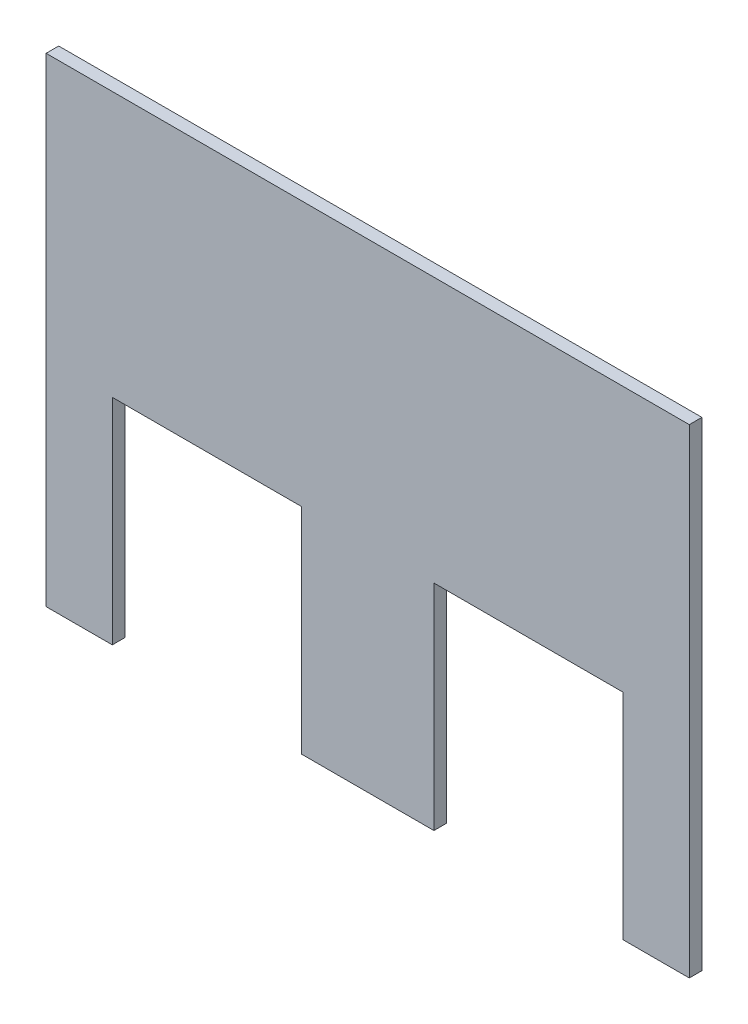
ISO-10303-21;
HEADER;
FILE_DESCRIPTION(('STEP AP214'),'2;1');
FILE_NAME('part.step','',(''),(''),'','','');
FILE_SCHEMA(('AUTOMOTIVE_DESIGN { 1 0 10303 214 1 1 1 1 }'));
ENDSEC;
DATA;
#1=APPLICATION_CONTEXT('core data for automotive mechanical design processes');
#2=APPLICATION_PROTOCOL_DEFINITION('international standard','automotive_design',2000,#1);
#3=PRODUCT_CONTEXT('',#1,'mechanical');
#4=PRODUCT('Part','Part','',(#3));
#5=PRODUCT_RELATED_PRODUCT_CATEGORY('part','',(#4));
#6=PRODUCT_DEFINITION_FORMATION('','',#4);
#7=PRODUCT_DEFINITION_CONTEXT('part definition',#1,'design');
#8=PRODUCT_DEFINITION('design','',#6,#7);
#9=PRODUCT_DEFINITION_SHAPE('','',#8);
#10=(LENGTH_UNIT() NAMED_UNIT(*) SI_UNIT(.MILLI.,.METRE.));
#11=(NAMED_UNIT(*) PLANE_ANGLE_UNIT() SI_UNIT($,.RADIAN.));
#12=(NAMED_UNIT(*) SI_UNIT($,.STERADIAN.) SOLID_ANGLE_UNIT());
#13=UNCERTAINTY_MEASURE_WITH_UNIT(LENGTH_MEASURE(1.E-05),#10,'distance_accuracy_value','');
#14=(GEOMETRIC_REPRESENTATION_CONTEXT(3) GLOBAL_UNCERTAINTY_ASSIGNED_CONTEXT((#13)) GLOBAL_UNIT_ASSIGNED_CONTEXT((#10,
#11,#12)) REPRESENTATION_CONTEXT('',''));
#15=CARTESIAN_POINT('',(0.,0.,0.));
#16=DIRECTION('',(0.,0.,1.));
#17=DIRECTION('',(1.,0.,0.));
#18=AXIS2_PLACEMENT_3D('',#15,#16,#17);
#19=CARTESIAN_POINT('',(0.,3.60822483003176E-12,10.));
#20=DIRECTION('',(0.,1.,0.));
#21=DIRECTION('',(0.,0.,1.));
#22=AXIS2_PLACEMENT_3D('',#19,#20,#21);
#23=PLANE('',#22);
#24=DIRECTION('',(0.,0.,1.));
#25=VECTOR('',#24,1.);
#26=CARTESIAN_POINT('',(52.5,0.,0.));
#27=LINE('',#26,#25);
#28=CARTESIAN_POINT('',(52.5,3.60822483003176E-12,0.));
#29=VERTEX_POINT('',#28);
#30=CARTESIAN_POINT('',(52.5,0.,10.));
#31=VERTEX_POINT('',#30);
#32=EDGE_CURVE('E55',#29,#31,#27,.T.);
#33=ORIENTED_EDGE('',*,*,#32,.T.);
#34=DIRECTION('',(1.,0.,0.));
#35=VECTOR('',#34,1.);
#36=CARTESIAN_POINT('',(0.,3.60822483003176E-12,10.));
#37=LINE('',#36,#35);
#38=CARTESIAN_POINT('',(0.,3.60822483003176E-12,10.));
#39=VERTEX_POINT('',#38);
#40=EDGE_CURVE('E184',#39,#31,#37,.T.);
#41=ORIENTED_EDGE('',*,*,#40,.F.);
#42=DIRECTION('',(0.,0.,-1.));
#43=VECTOR('',#42,1.);
#44=CARTESIAN_POINT('',(0.,3.60822483003176E-12,10.));
#45=LINE('',#44,#43);
#46=CARTESIAN_POINT('',(0.,3.60822483003176E-12,0.));
#47=VERTEX_POINT('',#46);
#48=EDGE_CURVE('E11',#39,#47,#45,.T.);
#49=ORIENTED_EDGE('',*,*,#48,.T.);
#50=DIRECTION('',(1.,0.,0.));
#51=VECTOR('',#50,1.);
#52=CARTESIAN_POINT('',(0.,3.60822483003176E-12,0.));
#53=LINE('',#52,#51);
#54=EDGE_CURVE('E196',#47,#29,#53,.T.);
#55=ORIENTED_EDGE('',*,*,#54,.T.);
#56=EDGE_LOOP('',(#33,#41,#49,#55));
#57=FACE_BOUND('',#56,.T.);
#58=ADVANCED_FACE('F32',(#57),#23,.F.);
#59=CARTESIAN_POINT('',(202.5,0.,10.));
#60=VERTEX_POINT('',#59);
#61=CARTESIAN_POINT('',(307.5,0.,10.));
#62=VERTEX_POINT('',#61);
#63=EDGE_CURVE('E188',#60,#62,#37,.T.);
#64=ORIENTED_EDGE('',*,*,#63,.F.);
#65=DIRECTION('',(0.,0.,1.));
#66=VECTOR('',#65,1.);
#67=CARTESIAN_POINT('',(202.5,0.,0.));
#68=LINE('',#67,#66);
#69=CARTESIAN_POINT('',(202.5,0.,0.));
#70=VERTEX_POINT('',#69);
#71=EDGE_CURVE('E153',#70,#60,#68,.T.);
#72=ORIENTED_EDGE('',*,*,#71,.F.);
#73=CARTESIAN_POINT('',(307.5,0.,0.));
#74=VERTEX_POINT('',#73);
#75=EDGE_CURVE('E199',#70,#74,#53,.T.);
#76=ORIENTED_EDGE('',*,*,#75,.T.);
#77=DIRECTION('',(0.,0.,1.));
#78=VECTOR('',#77,1.);
#79=CARTESIAN_POINT('',(307.5,0.,0.));
#80=LINE('',#79,#78);
#81=EDGE_CURVE('E148',#74,#62,#80,.T.);
#82=ORIENTED_EDGE('',*,*,#81,.T.);
#83=EDGE_LOOP('',(#64,#72,#76,#82));
#84=FACE_BOUND('',#83,.T.);
#85=ADVANCED_FACE('F235',(#84),#23,.F.);
#86=CARTESIAN_POINT('',(0.,0.,10.));
#87=DIRECTION('',(0.,0.,1.));
#88=DIRECTION('',(1.,0.,0.));
#89=AXIS2_PLACEMENT_3D('',#86,#87,#88);
#90=PLANE('',#89);
#91=DIRECTION('',(0.,1.,0.));
#92=VECTOR('',#91,1.);
#93=CARTESIAN_POINT('',(202.5,0.,10.));
#94=LINE('',#93,#92);
#95=CARTESIAN_POINT('',(202.5,170.,10.));
#96=VERTEX_POINT('',#95);
#97=EDGE_CURVE('E140',#60,#96,#94,.T.);
#98=ORIENTED_EDGE('',*,*,#97,.F.);
#99=ORIENTED_EDGE('',*,*,#63,.T.);
#100=DIRECTION('',(0.,1.,0.));
#101=VECTOR('',#100,1.);
#102=CARTESIAN_POINT('',(307.5,0.,10.));
#103=LINE('',#102,#101);
#104=CARTESIAN_POINT('',(307.5,170.,10.));
#105=VERTEX_POINT('',#104);
#106=EDGE_CURVE('E159',#62,#105,#103,.T.);
#107=ORIENTED_EDGE('',*,*,#106,.T.);
#108=DIRECTION('',(-1.,0.,0.));
#109=VECTOR('',#108,1.);
#110=CARTESIAN_POINT('',(0.,170.,10.));
#111=LINE('',#110,#109);
#112=CARTESIAN_POINT('',(457.5,170.,10.));
#113=VERTEX_POINT('',#112);
#114=EDGE_CURVE('E167',#113,#105,#111,.T.);
#115=ORIENTED_EDGE('',*,*,#114,.F.);
#116=DIRECTION('',(0.,1.,0.));
#117=VECTOR('',#116,1.);
#118=CARTESIAN_POINT('',(457.5,0.,10.));
#119=LINE('',#118,#117);
#120=CARTESIAN_POINT('',(457.5,0.,10.));
#121=VERTEX_POINT('',#120);
#122=EDGE_CURVE('E164',#121,#113,#119,.T.);
#123=ORIENTED_EDGE('',*,*,#122,.F.);
#124=CARTESIAN_POINT('',(510.,3.60822483003176E-12,10.));
#125=VERTEX_POINT('',#124);
#126=EDGE_CURVE('E182',#121,#125,#37,.T.);
#127=ORIENTED_EDGE('',*,*,#126,.T.);
#128=DIRECTION('',(0.,1.,0.));
#129=VECTOR('',#128,1.);
#130=CARTESIAN_POINT('',(510.,380.,10.));
#131=LINE('',#130,#129);
#132=CARTESIAN_POINT('',(510.,380.,10.));
#133=VERTEX_POINT('',#132);
#134=EDGE_CURVE('E187',#125,#133,#131,.T.);
#135=ORIENTED_EDGE('',*,*,#134,.T.);
#136=DIRECTION('',(-1.,0.,0.));
#137=VECTOR('',#136,1.);
#138=CARTESIAN_POINT('',(0.,380.,10.));
#139=LINE('',#138,#137);
#140=CARTESIAN_POINT('',(0.,380.,10.));
#141=VERTEX_POINT('',#140);
#142=EDGE_CURVE('E190',#133,#141,#139,.T.);
#143=ORIENTED_EDGE('',*,*,#142,.T.);
#144=DIRECTION('',(0.,-1.,0.));
#145=VECTOR('',#144,1.);
#146=CARTESIAN_POINT('',(0.,380.,10.));
#147=LINE('',#146,#145);
#148=EDGE_CURVE('E179',#141,#39,#147,.T.);
#149=ORIENTED_EDGE('',*,*,#148,.T.);
#150=ORIENTED_EDGE('',*,*,#40,.T.);
#151=DIRECTION('',(0.,1.,0.));
#152=VECTOR('',#151,1.);
#153=CARTESIAN_POINT('',(52.5,0.,10.));
#154=LINE('',#153,#152);
#155=CARTESIAN_POINT('',(52.5,170.,10.));
#156=VERTEX_POINT('',#155);
#157=EDGE_CURVE('E143',#31,#156,#154,.T.);
#158=ORIENTED_EDGE('',*,*,#157,.T.);
#159=DIRECTION('',(1.,0.,0.));
#160=VECTOR('',#159,1.);
#161=CARTESIAN_POINT('',(0.,170.,10.));
#162=LINE('',#161,#160);
#163=EDGE_CURVE('E134',#156,#96,#162,.T.);
#164=ORIENTED_EDGE('',*,*,#163,.T.);
#165=EDGE_LOOP('',(#98,#99,#107,#115,#123,#127,#135,#143,#149,#150,#158,#164));
#166=FACE_BOUND('',#165,.T.);
#167=ADVANCED_FACE('F227',(#166),#90,.T.);
#168=CARTESIAN_POINT('',(0.,0.,0.));
#169=DIRECTION('',(0.,0.,1.));
#170=DIRECTION('',(1.,0.,0.));
#171=AXIS2_PLACEMENT_3D('',#168,#169,#170);
#172=PLANE('',#171);
#173=ORIENTED_EDGE('',*,*,#75,.F.);
#174=DIRECTION('',(0.,1.,0.));
#175=VECTOR('',#174,1.);
#176=CARTESIAN_POINT('',(202.5,0.,0.));
#177=LINE('',#176,#175);
#178=CARTESIAN_POINT('',(202.5,170.,0.));
#179=VERTEX_POINT('',#178);
#180=EDGE_CURVE('E127',#70,#179,#177,.T.);
#181=ORIENTED_EDGE('',*,*,#180,.T.);
#182=DIRECTION('',(1.,0.,0.));
#183=VECTOR('',#182,1.);
#184=CARTESIAN_POINT('',(0.,170.,0.));
#185=LINE('',#184,#183);
#186=CARTESIAN_POINT('',(52.5,170.,0.));
#187=VERTEX_POINT('',#186);
#188=EDGE_CURVE('E128',#187,#179,#185,.T.);
#189=ORIENTED_EDGE('',*,*,#188,.F.);
#190=DIRECTION('',(0.,1.,0.));
#191=VECTOR('',#190,1.);
#192=CARTESIAN_POINT('',(52.5,0.,0.));
#193=LINE('',#192,#191);
#194=EDGE_CURVE('E119',#29,#187,#193,.T.);
#195=ORIENTED_EDGE('',*,*,#194,.F.);
#196=ORIENTED_EDGE('',*,*,#54,.F.);
#197=DIRECTION('',(0.,-1.,0.));
#198=VECTOR('',#197,1.);
#199=CARTESIAN_POINT('',(0.,380.,0.));
#200=LINE('',#199,#198);
#201=CARTESIAN_POINT('',(0.,380.,0.));
#202=VERTEX_POINT('',#201);
#203=EDGE_CURVE('E152',#202,#47,#200,.T.);
#204=ORIENTED_EDGE('',*,*,#203,.F.);
#205=DIRECTION('',(-1.,0.,0.));
#206=VECTOR('',#205,1.);
#207=CARTESIAN_POINT('',(0.,380.,0.));
#208=LINE('',#207,#206);
#209=CARTESIAN_POINT('',(510.,380.,0.));
#210=VERTEX_POINT('',#209);
#211=EDGE_CURVE('E183',#210,#202,#208,.T.);
#212=ORIENTED_EDGE('',*,*,#211,.F.);
#213=DIRECTION('',(0.,1.,0.));
#214=VECTOR('',#213,1.);
#215=CARTESIAN_POINT('',(510.,380.,0.));
#216=LINE('',#215,#214);
#217=CARTESIAN_POINT('',(510.,3.60822483003176E-12,0.));
#218=VERTEX_POINT('',#217);
#219=EDGE_CURVE('E198',#218,#210,#216,.T.);
#220=ORIENTED_EDGE('',*,*,#219,.F.);
#221=CARTESIAN_POINT('',(457.5,0.,0.));
#222=VERTEX_POINT('',#221);
#223=EDGE_CURVE('E195',#222,#218,#53,.T.);
#224=ORIENTED_EDGE('',*,*,#223,.F.);
#225=DIRECTION('',(0.,1.,0.));
#226=VECTOR('',#225,1.);
#227=CARTESIAN_POINT('',(457.5,0.,0.));
#228=LINE('',#227,#226);
#229=CARTESIAN_POINT('',(457.5,170.,0.));
#230=VERTEX_POINT('',#229);
#231=EDGE_CURVE('E156',#222,#230,#228,.T.);
#232=ORIENTED_EDGE('',*,*,#231,.T.);
#233=DIRECTION('',(-1.,0.,0.));
#234=VECTOR('',#233,1.);
#235=CARTESIAN_POINT('',(0.,170.,0.));
#236=LINE('',#235,#234);
#237=CARTESIAN_POINT('',(307.5,170.,0.));
#238=VERTEX_POINT('',#237);
#239=EDGE_CURVE('E47',#230,#238,#236,.T.);
#240=ORIENTED_EDGE('',*,*,#239,.T.);
#241=DIRECTION('',(0.,1.,0.));
#242=VECTOR('',#241,1.);
#243=CARTESIAN_POINT('',(307.5,0.,0.));
#244=LINE('',#243,#242);
#245=EDGE_CURVE('E161',#74,#238,#244,.T.);
#246=ORIENTED_EDGE('',*,*,#245,.F.);
#247=EDGE_LOOP('',(#173,#181,#189,#195,#196,#204,#212,#220,#224,#232,#240,#246));
#248=FACE_BOUND('',#247,.T.);
#249=ADVANCED_FACE('F139',(#248),#172,.F.);
#250=CARTESIAN_POINT('',(0.,380.,10.));
#251=DIRECTION('',(1.,0.,0.));
#252=DIRECTION('',(0.,0.,-1.));
#253=AXIS2_PLACEMENT_3D('',#250,#251,#252);
#254=PLANE('',#253);
#255=ORIENTED_EDGE('',*,*,#203,.T.);
#256=ORIENTED_EDGE('',*,*,#48,.F.);
#257=ORIENTED_EDGE('',*,*,#148,.F.);
#258=DIRECTION('',(0.,0.,-1.));
#259=VECTOR('',#258,1.);
#260=CARTESIAN_POINT('',(0.,380.,10.));
#261=LINE('',#260,#259);
#262=EDGE_CURVE('E192',#141,#202,#261,.T.);
#263=ORIENTED_EDGE('',*,*,#262,.T.);
#264=EDGE_LOOP('',(#255,#256,#257,#263));
#265=FACE_BOUND('',#264,.T.);
#266=ADVANCED_FACE('F34',(#265),#254,.F.);
#267=ORIENTED_EDGE('',*,*,#126,.F.);
#268=DIRECTION('',(0.,0.,1.));
#269=VECTOR('',#268,1.);
#270=CARTESIAN_POINT('',(457.5,0.,0.));
#271=LINE('',#270,#269);
#272=EDGE_CURVE('E163',#222,#121,#271,.T.);
#273=ORIENTED_EDGE('',*,*,#272,.F.);
#274=ORIENTED_EDGE('',*,*,#223,.T.);
#275=DIRECTION('',(0.,0.,-1.));
#276=VECTOR('',#275,1.);
#277=CARTESIAN_POINT('',(510.,3.60822483003176E-12,10.));
#278=LINE('',#277,#276);
#279=EDGE_CURVE('E40',#125,#218,#278,.T.);
#280=ORIENTED_EDGE('',*,*,#279,.F.);
#281=EDGE_LOOP('',(#267,#273,#274,#280));
#282=FACE_BOUND('',#281,.T.);
#283=ADVANCED_FACE('F242',(#282),#23,.F.);
#284=CARTESIAN_POINT('',(510.,380.,10.));
#285=DIRECTION('',(-1.,0.,0.));
#286=DIRECTION('',(0.,0.,1.));
#287=AXIS2_PLACEMENT_3D('',#284,#285,#286);
#288=PLANE('',#287);
#289=ORIENTED_EDGE('',*,*,#219,.T.);
#290=DIRECTION('',(0.,0.,-1.));
#291=VECTOR('',#290,1.);
#292=CARTESIAN_POINT('',(510.,380.,10.));
#293=LINE('',#292,#291);
#294=EDGE_CURVE('E204',#133,#210,#293,.T.);
#295=ORIENTED_EDGE('',*,*,#294,.F.);
#296=ORIENTED_EDGE('',*,*,#134,.F.);
#297=ORIENTED_EDGE('',*,*,#279,.T.);
#298=EDGE_LOOP('',(#289,#295,#296,#297));
#299=FACE_BOUND('',#298,.T.);
#300=ADVANCED_FACE('F211',(#299),#288,.F.);
#301=CARTESIAN_POINT('',(0.,380.,10.));
#302=DIRECTION('',(0.,-1.,0.));
#303=DIRECTION('',(0.,0.,-1.));
#304=AXIS2_PLACEMENT_3D('',#301,#302,#303);
#305=PLANE('',#304);
#306=ORIENTED_EDGE('',*,*,#211,.T.);
#307=ORIENTED_EDGE('',*,*,#262,.F.);
#308=ORIENTED_EDGE('',*,*,#142,.F.);
#309=ORIENTED_EDGE('',*,*,#294,.T.);
#310=EDGE_LOOP('',(#306,#307,#308,#309));
#311=FACE_BOUND('',#310,.T.);
#312=ADVANCED_FACE('F220',(#311),#305,.F.);
#313=CARTESIAN_POINT('',(307.5,0.,0.));
#314=DIRECTION('',(1.,0.,0.));
#315=DIRECTION('',(0.,0.,-1.));
#316=AXIS2_PLACEMENT_3D('',#313,#314,#315);
#317=PLANE('',#316);
#318=ORIENTED_EDGE('',*,*,#106,.F.);
#319=ORIENTED_EDGE('',*,*,#81,.F.);
#320=ORIENTED_EDGE('',*,*,#245,.T.);
#321=DIRECTION('',(0.,0.,1.));
#322=VECTOR('',#321,1.);
#323=CARTESIAN_POINT('',(307.5,170.,0.));
#324=LINE('',#323,#322);
#325=EDGE_CURVE('E174',#238,#105,#324,.T.);
#326=ORIENTED_EDGE('',*,*,#325,.T.);
#327=EDGE_LOOP('',(#318,#319,#320,#326));
#328=FACE_BOUND('',#327,.T.);
#329=ADVANCED_FACE('F239',(#328),#317,.T.);
#330=CARTESIAN_POINT('',(0.,170.,0.));
#331=DIRECTION('',(0.,1.,0.));
#332=DIRECTION('',(0.,0.,1.));
#333=AXIS2_PLACEMENT_3D('',#330,#331,#332);
#334=PLANE('',#333);
#335=ORIENTED_EDGE('',*,*,#114,.T.);
#336=ORIENTED_EDGE('',*,*,#325,.F.);
#337=ORIENTED_EDGE('',*,*,#239,.F.);
#338=DIRECTION('',(0.,0.,1.));
#339=VECTOR('',#338,1.);
#340=CARTESIAN_POINT('',(457.5,170.,0.));
#341=LINE('',#340,#339);
#342=EDGE_CURVE('E176',#230,#113,#341,.T.);
#343=ORIENTED_EDGE('',*,*,#342,.T.);
#344=EDGE_LOOP('',(#335,#336,#337,#343));
#345=FACE_BOUND('',#344,.T.);
#346=ADVANCED_FACE('F267',(#345),#334,.F.);
#347=CARTESIAN_POINT('',(457.5,0.,0.));
#348=DIRECTION('',(1.,0.,0.));
#349=DIRECTION('',(0.,0.,-1.));
#350=AXIS2_PLACEMENT_3D('',#347,#348,#349);
#351=PLANE('',#350);
#352=ORIENTED_EDGE('',*,*,#122,.T.);
#353=ORIENTED_EDGE('',*,*,#342,.F.);
#354=ORIENTED_EDGE('',*,*,#231,.F.);
#355=ORIENTED_EDGE('',*,*,#272,.T.);
#356=EDGE_LOOP('',(#352,#353,#354,#355));
#357=FACE_BOUND('',#356,.T.);
#358=ADVANCED_FACE('F241',(#357),#351,.F.);
#359=CARTESIAN_POINT('',(0.,170.,0.));
#360=DIRECTION('',(0.,-1.,0.));
#361=DIRECTION('',(0.,0.,-1.));
#362=AXIS2_PLACEMENT_3D('',#359,#360,#361);
#363=PLANE('',#362);
#364=ORIENTED_EDGE('',*,*,#163,.F.);
#365=DIRECTION('',(0.,0.,1.));
#366=VECTOR('',#365,1.);
#367=CARTESIAN_POINT('',(52.5,170.,0.));
#368=LINE('',#367,#366);
#369=EDGE_CURVE('E122',#187,#156,#368,.T.);
#370=ORIENTED_EDGE('',*,*,#369,.F.);
#371=ORIENTED_EDGE('',*,*,#188,.T.);
#372=DIRECTION('',(0.,0.,1.));
#373=VECTOR('',#372,1.);
#374=CARTESIAN_POINT('',(202.5,170.,0.));
#375=LINE('',#374,#373);
#376=EDGE_CURVE('E150',#179,#96,#375,.T.);
#377=ORIENTED_EDGE('',*,*,#376,.T.);
#378=EDGE_LOOP('',(#364,#370,#371,#377));
#379=FACE_BOUND('',#378,.T.);
#380=ADVANCED_FACE('F131',(#379),#363,.T.);
#381=CARTESIAN_POINT('',(202.5,0.,0.));
#382=DIRECTION('',(1.,0.,0.));
#383=DIRECTION('',(0.,0.,-1.));
#384=AXIS2_PLACEMENT_3D('',#381,#382,#383);
#385=PLANE('',#384);
#386=ORIENTED_EDGE('',*,*,#97,.T.);
#387=ORIENTED_EDGE('',*,*,#376,.F.);
#388=ORIENTED_EDGE('',*,*,#180,.F.);
#389=ORIENTED_EDGE('',*,*,#71,.T.);
#390=EDGE_LOOP('',(#386,#387,#388,#389));
#391=FACE_BOUND('',#390,.T.);
#392=ADVANCED_FACE('F275',(#391),#385,.F.);
#393=CARTESIAN_POINT('',(52.5,0.,0.));
#394=DIRECTION('',(1.,0.,0.));
#395=DIRECTION('',(0.,0.,-1.));
#396=AXIS2_PLACEMENT_3D('',#393,#394,#395);
#397=PLANE('',#396);
#398=ORIENTED_EDGE('',*,*,#157,.F.);
#399=ORIENTED_EDGE('',*,*,#32,.F.);
#400=ORIENTED_EDGE('',*,*,#194,.T.);
#401=ORIENTED_EDGE('',*,*,#369,.T.);
#402=EDGE_LOOP('',(#398,#399,#400,#401));
#403=FACE_BOUND('',#402,.T.);
#404=ADVANCED_FACE('F121',(#403),#397,.T.);
#405=CLOSED_SHELL('',(#58,#85,#167,#249,#266,#283,#300,#312,#329,#346,#358,#380,#392,#404));
#406=MANIFOLD_SOLID_BREP('B2',#405);
#407=ADVANCED_BREP_SHAPE_REPRESENTATION('',(#18,#406),#14);
#408=SHAPE_DEFINITION_REPRESENTATION(#9,#407);
ENDSEC;
END-ISO-10303-21;
